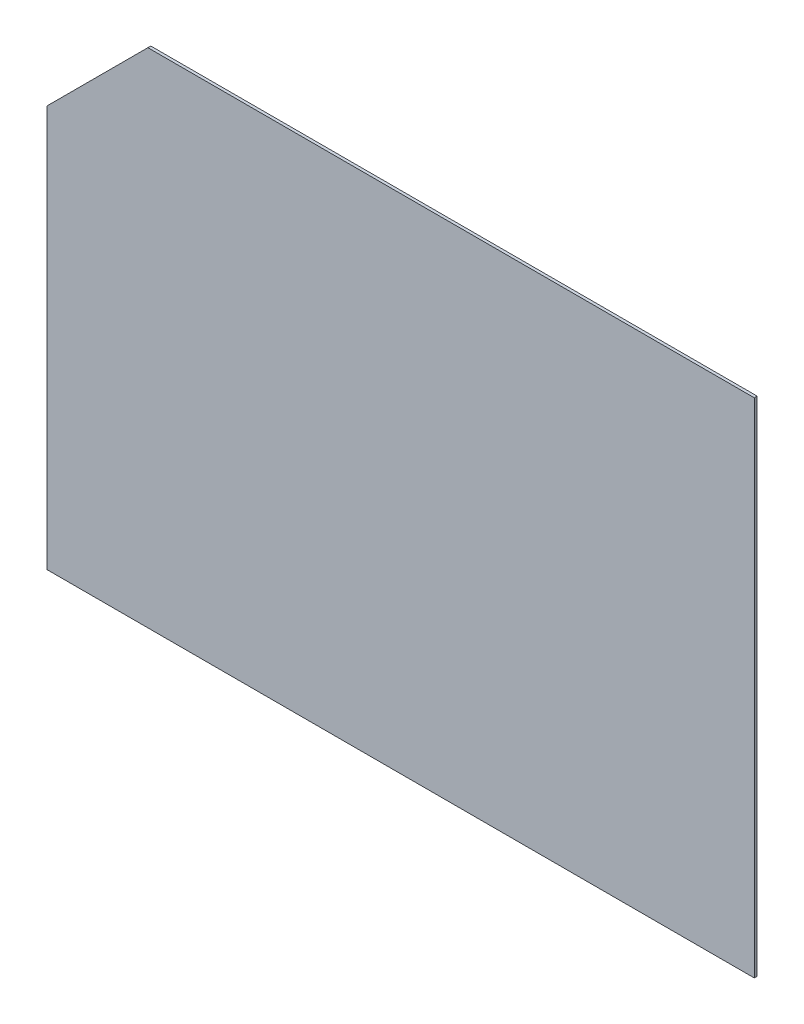
ISO-10303-21;
HEADER;
FILE_DESCRIPTION(('STEP AP214'),'2;1');
FILE_NAME('part.step','',(''),(''),'','','');
FILE_SCHEMA(('AUTOMOTIVE_DESIGN { 1 0 10303 214 1 1 1 1 }'));
ENDSEC;
DATA;
#1=APPLICATION_CONTEXT('core data for automotive mechanical design processes');
#2=APPLICATION_PROTOCOL_DEFINITION('international standard','automotive_design',2000,#1);
#3=PRODUCT_CONTEXT('',#1,'mechanical');
#4=PRODUCT('Part','Part','',(#3));
#5=PRODUCT_RELATED_PRODUCT_CATEGORY('part','',(#4));
#6=PRODUCT_DEFINITION_FORMATION('','',#4);
#7=PRODUCT_DEFINITION_CONTEXT('part definition',#1,'design');
#8=PRODUCT_DEFINITION('design','',#6,#7);
#9=PRODUCT_DEFINITION_SHAPE('','',#8);
#10=(LENGTH_UNIT() NAMED_UNIT(*) SI_UNIT(.MILLI.,.METRE.));
#11=(NAMED_UNIT(*) PLANE_ANGLE_UNIT() SI_UNIT($,.RADIAN.));
#12=(NAMED_UNIT(*) SI_UNIT($,.STERADIAN.) SOLID_ANGLE_UNIT());
#13=UNCERTAINTY_MEASURE_WITH_UNIT(LENGTH_MEASURE(1.E-05),#10,'distance_accuracy_value','');
#14=(GEOMETRIC_REPRESENTATION_CONTEXT(3) GLOBAL_UNCERTAINTY_ASSIGNED_CONTEXT((#13)) GLOBAL_UNIT_ASSIGNED_CONTEXT((#10,
#11,#12)) REPRESENTATION_CONTEXT('',''));
#15=CARTESIAN_POINT('',(0.,0.,0.));
#16=DIRECTION('',(0.,0.,1.));
#17=DIRECTION('',(1.,0.,0.));
#18=AXIS2_PLACEMENT_3D('',#15,#16,#17);
#19=CARTESIAN_POINT('',(55.279792114108,16.410471046049,0.01));
#20=DIRECTION('',(0.,0.,-1.));
#21=DIRECTION('',(0.,-1.,0.));
#22=AXIS2_PLACEMENT_3D('',#19,#20,#21);
#23=PLANE('',#22);
#24=DIRECTION('',(0.999999999999985,1.74845553146897E-07,0.));
#25=VECTOR('',#24,1.);
#26=CARTESIAN_POINT('',(55.279792114108,16.410471046049,0.01));
#27=LINE('',#26,#25);
#28=CARTESIAN_POINT('',(55.279792114108,16.410471046049,0.01));
#29=VERTEX_POINT('',#28);
#30=CARTESIAN_POINT('',(57.729792114108,16.41047147442,0.01));
#31=VERTEX_POINT('',#30);
#32=EDGE_CURVE('E112',#29,#31,#27,.T.);
#33=ORIENTED_EDGE('',*,*,#32,.T.);
#34=DIRECTION('',(-1.74845553146897E-07,0.999999999999985,0.));
#35=VECTOR('',#34,1.);
#36=CARTESIAN_POINT('',(57.729792114108,16.41047147442,0.01));
#37=LINE('',#36,#35);
#38=CARTESIAN_POINT('',(57.729791809877,18.15047147442,0.01));
#39=VERTEX_POINT('',#38);
#40=EDGE_CURVE('E79',#31,#39,#37,.T.);
#41=ORIENTED_EDGE('',*,*,#40,.T.);
#42=DIRECTION('',(-0.999999999999985,-1.74845553146897E-07,0.));
#43=VECTOR('',#42,1.);
#44=CARTESIAN_POINT('',(57.729791809877,18.15047147442,0.01));
#45=LINE('',#44,#43);
#46=CARTESIAN_POINT('',(55.629791809877,18.150471107245,0.01));
#47=VERTEX_POINT('',#46);
#48=EDGE_CURVE('E87',#39,#47,#45,.T.);
#49=ORIENTED_EDGE('',*,*,#48,.T.);
#50=DIRECTION('',(-0.707106657552037,-0.707106904821037,0.));
#51=VECTOR('',#50,1.);
#52=CARTESIAN_POINT('',(55.629791809877,18.150471107245,0.01));
#53=LINE('',#52,#51);
#54=CARTESIAN_POINT('',(55.279791871073,17.800471046049,0.01));
#55=VERTEX_POINT('',#54);
#56=EDGE_CURVE('E124',#47,#55,#53,.T.);
#57=ORIENTED_EDGE('',*,*,#56,.T.);
#58=DIRECTION('',(1.74845553146897E-07,-0.999999999999985,0.));
#59=VECTOR('',#58,1.);
#60=CARTESIAN_POINT('',(55.279791871073,17.800471046049,0.01));
#61=LINE('',#60,#59);
#62=EDGE_CURVE('E11',#55,#29,#61,.T.);
#63=ORIENTED_EDGE('',*,*,#62,.T.);
#64=EDGE_LOOP('',(#33,#41,#49,#57,#63));
#65=FACE_BOUND('',#64,.T.);
#66=ADVANCED_FACE('F16',(#65),#23,.F.);
#67=CARTESIAN_POINT('',(55.279792114108,16.410471046049,0.));
#68=DIRECTION('',(0.,0.,-1.));
#69=DIRECTION('',(0.,-1.,0.));
#70=AXIS2_PLACEMENT_3D('',#67,#68,#69);
#71=PLANE('',#70);
#72=DIRECTION('',(1.74845553146897E-07,-0.999999999999985,0.));
#73=VECTOR('',#72,1.);
#74=CARTESIAN_POINT('',(55.279791871073,17.800471046049,0.));
#75=LINE('',#74,#73);
#76=CARTESIAN_POINT('',(55.279791871073,17.800471046049,0.));
#77=VERTEX_POINT('',#76);
#78=CARTESIAN_POINT('',(55.279792114108,16.410471046049,0.));
#79=VERTEX_POINT('',#78);
#80=EDGE_CURVE('E27',#77,#79,#75,.T.);
#81=ORIENTED_EDGE('',*,*,#80,.F.);
#82=DIRECTION('',(-0.707106657552037,-0.707106904821037,0.));
#83=VECTOR('',#82,1.);
#84=CARTESIAN_POINT('',(55.629791809877,18.150471107245,0.));
#85=LINE('',#84,#83);
#86=CARTESIAN_POINT('',(55.629791809877,18.150471107245,0.));
#87=VERTEX_POINT('',#86);
#88=EDGE_CURVE('E92',#87,#77,#85,.T.);
#89=ORIENTED_EDGE('',*,*,#88,.F.);
#90=DIRECTION('',(-0.999999999999985,-1.74845553146897E-07,0.));
#91=VECTOR('',#90,1.);
#92=CARTESIAN_POINT('',(57.729791809877,18.15047147442,0.));
#93=LINE('',#92,#91);
#94=CARTESIAN_POINT('',(57.729791809877,18.15047147442,0.));
#95=VERTEX_POINT('',#94);
#96=EDGE_CURVE('E90',#95,#87,#93,.T.);
#97=ORIENTED_EDGE('',*,*,#96,.F.);
#98=DIRECTION('',(-1.74845553146897E-07,0.999999999999985,0.));
#99=VECTOR('',#98,1.);
#100=CARTESIAN_POINT('',(57.729792114108,16.41047147442,0.));
#101=LINE('',#100,#99);
#102=CARTESIAN_POINT('',(57.729792114108,16.41047147442,0.));
#103=VERTEX_POINT('',#102);
#104=EDGE_CURVE('E68',#103,#95,#101,.T.);
#105=ORIENTED_EDGE('',*,*,#104,.F.);
#106=DIRECTION('',(0.999999999999985,1.74845553146897E-07,0.));
#107=VECTOR('',#106,1.);
#108=CARTESIAN_POINT('',(55.279792114108,16.410471046049,0.));
#109=LINE('',#108,#107);
#110=EDGE_CURVE('E20',#79,#103,#109,.T.);
#111=ORIENTED_EDGE('',*,*,#110,.F.);
#112=EDGE_LOOP('',(#81,#89,#97,#105,#111));
#113=FACE_BOUND('',#112,.T.);
#114=ADVANCED_FACE('F18',(#113),#71,.T.);
#115=CARTESIAN_POINT('',(55.279791871073,17.800471046049,0.));
#116=DIRECTION('',(0.999999999999985,1.74845553146897E-07,0.));
#117=DIRECTION('',(0.,0.,-1.));
#118=AXIS2_PLACEMENT_3D('',#115,#116,#117);
#119=PLANE('',#118);
#120=ORIENTED_EDGE('',*,*,#80,.T.);
#121=DIRECTION('',(0.,0.,1.));
#122=VECTOR('',#121,1.);
#123=CARTESIAN_POINT('',(55.279792114108,16.410471046049,0.));
#124=LINE('',#123,#122);
#125=EDGE_CURVE('E106',#79,#29,#124,.T.);
#126=ORIENTED_EDGE('',*,*,#125,.T.);
#127=ORIENTED_EDGE('',*,*,#62,.F.);
#128=DIRECTION('',(0.,0.,1.));
#129=VECTOR('',#128,1.);
#130=CARTESIAN_POINT('',(55.279791871073,17.800471046049,0.));
#131=LINE('',#130,#129);
#132=EDGE_CURVE('E119',#77,#55,#131,.T.);
#133=ORIENTED_EDGE('',*,*,#132,.F.);
#134=EDGE_LOOP('',(#120,#126,#127,#133));
#135=FACE_BOUND('',#134,.T.);
#136=ADVANCED_FACE('F191',(#135),#119,.F.);
#137=CARTESIAN_POINT('',(55.629791809877,18.150471107245,0.));
#138=DIRECTION('',(0.707106904821037,-0.707106657552037,0.));
#139=DIRECTION('',(0.,0.,-1.));
#140=AXIS2_PLACEMENT_3D('',#137,#138,#139);
#141=PLANE('',#140);
#142=ORIENTED_EDGE('',*,*,#88,.T.);
#143=ORIENTED_EDGE('',*,*,#132,.T.);
#144=ORIENTED_EDGE('',*,*,#56,.F.);
#145=DIRECTION('',(0.,0.,1.));
#146=VECTOR('',#145,1.);
#147=CARTESIAN_POINT('',(55.629791809877,18.150471107245,0.));
#148=LINE('',#147,#146);
#149=EDGE_CURVE('E95',#87,#47,#148,.T.);
#150=ORIENTED_EDGE('',*,*,#149,.F.);
#151=EDGE_LOOP('',(#142,#143,#144,#150));
#152=FACE_BOUND('',#151,.T.);
#153=ADVANCED_FACE('F204',(#152),#141,.F.);
#154=CARTESIAN_POINT('',(57.729791809877,18.15047147442,0.));
#155=DIRECTION('',(1.74845553146897E-07,-0.999999999999985,0.));
#156=DIRECTION('',(0.,0.,-1.));
#157=AXIS2_PLACEMENT_3D('',#154,#155,#156);
#158=PLANE('',#157);
#159=ORIENTED_EDGE('',*,*,#96,.T.);
#160=ORIENTED_EDGE('',*,*,#149,.T.);
#161=ORIENTED_EDGE('',*,*,#48,.F.);
#162=DIRECTION('',(0.,0.,1.));
#163=VECTOR('',#162,1.);
#164=CARTESIAN_POINT('',(57.729791809877,18.15047147442,0.));
#165=LINE('',#164,#163);
#166=EDGE_CURVE('E97',#95,#39,#165,.T.);
#167=ORIENTED_EDGE('',*,*,#166,.F.);
#168=EDGE_LOOP('',(#159,#160,#161,#167));
#169=FACE_BOUND('',#168,.T.);
#170=ADVANCED_FACE('F98',(#169),#158,.F.);
#171=CARTESIAN_POINT('',(57.729792114108,16.41047147442,0.));
#172=DIRECTION('',(-0.999999999999985,-1.74845553146897E-07,0.));
#173=DIRECTION('',(-1.74845553146897E-07,0.999999999999985,0.));
#174=AXIS2_PLACEMENT_3D('',#171,#172,#173);
#175=PLANE('',#174);
#176=ORIENTED_EDGE('',*,*,#104,.T.);
#177=ORIENTED_EDGE('',*,*,#166,.T.);
#178=ORIENTED_EDGE('',*,*,#40,.F.);
#179=DIRECTION('',(0.,0.,1.));
#180=VECTOR('',#179,1.);
#181=CARTESIAN_POINT('',(57.729792114108,16.41047147442,0.));
#182=LINE('',#181,#180);
#183=EDGE_CURVE('E103',#103,#31,#182,.T.);
#184=ORIENTED_EDGE('',*,*,#183,.F.);
#185=EDGE_LOOP('',(#176,#177,#178,#184));
#186=FACE_BOUND('',#185,.T.);
#187=ADVANCED_FACE('F101',(#186),#175,.F.);
#188=CARTESIAN_POINT('',(55.279792114108,16.410471046049,0.));
#189=DIRECTION('',(-1.74845553146897E-07,0.999999999999985,0.));
#190=DIRECTION('',(0.,0.,1.));
#191=AXIS2_PLACEMENT_3D('',#188,#189,#190);
#192=PLANE('',#191);
#193=ORIENTED_EDGE('',*,*,#110,.T.);
#194=ORIENTED_EDGE('',*,*,#183,.T.);
#195=ORIENTED_EDGE('',*,*,#32,.F.);
#196=ORIENTED_EDGE('',*,*,#125,.F.);
#197=EDGE_LOOP('',(#193,#194,#195,#196));
#198=FACE_BOUND('',#197,.T.);
#199=ADVANCED_FACE('F140',(#198),#192,.F.);
#200=CLOSED_SHELL('',(#66,#114,#136,#153,#170,#187,#199));
#201=MANIFOLD_SOLID_BREP('B1',#200);
#202=ADVANCED_BREP_SHAPE_REPRESENTATION('',(#18,#201),#14);
#203=SHAPE_DEFINITION_REPRESENTATION(#9,#202);
ENDSEC;
END-ISO-10303-21;
